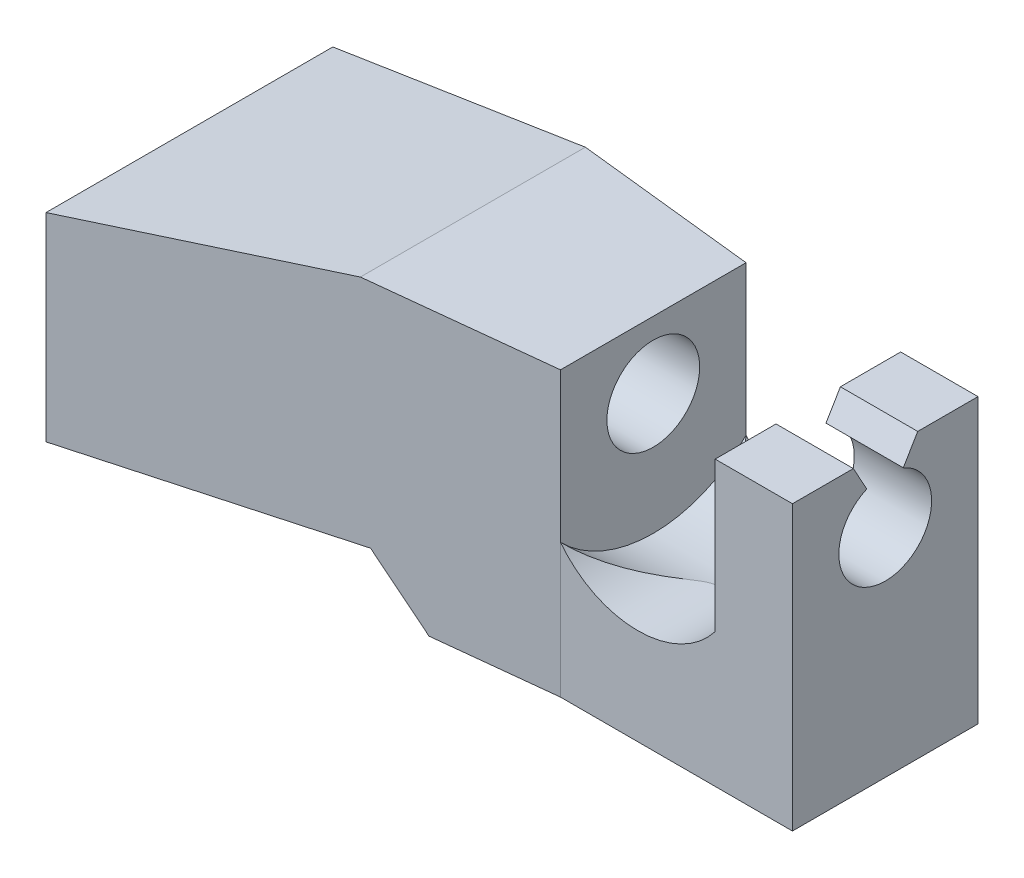
ISO-10303-21;
HEADER;
FILE_DESCRIPTION(('STEP AP214'),'2;1');
FILE_NAME('part.step','',(''),(''),'','','');
FILE_SCHEMA(('AUTOMOTIVE_DESIGN { 1 0 10303 214 1 1 1 1 }'));
ENDSEC;
DATA;
#1=APPLICATION_CONTEXT('core data for automotive mechanical design processes');
#2=APPLICATION_PROTOCOL_DEFINITION('international standard','automotive_design',2000,#1);
#3=PRODUCT_CONTEXT('',#1,'mechanical');
#4=PRODUCT('Part','Part','',(#3));
#5=PRODUCT_RELATED_PRODUCT_CATEGORY('part','',(#4));
#6=PRODUCT_DEFINITION_FORMATION('','',#4);
#7=PRODUCT_DEFINITION_CONTEXT('part definition',#1,'design');
#8=PRODUCT_DEFINITION('design','',#6,#7);
#9=PRODUCT_DEFINITION_SHAPE('','',#8);
#10=(LENGTH_UNIT() NAMED_UNIT(*) SI_UNIT(.MILLI.,.METRE.));
#11=(NAMED_UNIT(*) PLANE_ANGLE_UNIT() SI_UNIT($,.RADIAN.));
#12=(NAMED_UNIT(*) SI_UNIT($,.STERADIAN.) SOLID_ANGLE_UNIT());
#13=UNCERTAINTY_MEASURE_WITH_UNIT(LENGTH_MEASURE(1.E-05),#10,'distance_accuracy_value','');
#14=(GEOMETRIC_REPRESENTATION_CONTEXT(3) GLOBAL_UNCERTAINTY_ASSIGNED_CONTEXT((#13)) GLOBAL_UNIT_ASSIGNED_CONTEXT((#10,
#11,#12)) REPRESENTATION_CONTEXT('',''));
#15=CARTESIAN_POINT('',(0.,0.,0.));
#16=DIRECTION('',(0.,0.,1.));
#17=DIRECTION('',(1.,0.,0.));
#18=AXIS2_PLACEMENT_3D('',#15,#16,#17);
#19=CARTESIAN_POINT('',(0.,11.1135475228581,0.));
#20=DIRECTION('',(0.,-1.,0.));
#21=DIRECTION('',(1.,0.,0.));
#22=AXIS2_PLACEMENT_3D('',#19,#20,#21);
#23=PLANE('',#22);
#24=DIRECTION('',(1.,0.,0.));
#25=VECTOR('',#24,1.);
#26=CARTESIAN_POINT('',(181.643167142005,11.1135475228587,-6.30477493299963));
#27=LINE('',#26,#25);
#28=CARTESIAN_POINT('',(195.,11.1135475228588,-6.30477493299964));
#29=VERTEX_POINT('',#28);
#30=CARTESIAN_POINT('',(210.,11.1135475228588,-6.30477493299963));
#31=VERTEX_POINT('',#30);
#32=EDGE_CURVE('E597',#29,#31,#27,.T.);
#33=ORIENTED_EDGE('',*,*,#32,.T.);
#34=DIRECTION('',(0.,0.,1.));
#35=VECTOR('',#34,1.);
#36=CARTESIAN_POINT('',(210.,11.1135475228588,18.));
#37=LINE('',#36,#35);
#38=CARTESIAN_POINT('',(210.,11.1135475228588,-18.));
#39=VERTEX_POINT('',#38);
#40=EDGE_CURVE('E244',#39,#31,#37,.T.);
#41=ORIENTED_EDGE('',*,*,#40,.F.);
#42=DIRECTION('',(1.,0.,0.));
#43=VECTOR('',#42,1.);
#44=CARTESIAN_POINT('',(195.,11.1135475228587,-18.));
#45=LINE('',#44,#43);
#46=CARTESIAN_POINT('',(195.,11.1135475228587,-18.));
#47=VERTEX_POINT('',#46);
#48=EDGE_CURVE('E240',#47,#39,#45,.T.);
#49=ORIENTED_EDGE('',*,*,#48,.F.);
#50=DIRECTION('',(0.,0.,-1.));
#51=VECTOR('',#50,1.);
#52=CARTESIAN_POINT('',(195.,11.1135475228587,18.));
#53=LINE('',#52,#51);
#54=EDGE_CURVE('E177',#29,#47,#53,.T.);
#55=ORIENTED_EDGE('',*,*,#54,.F.);
#56=EDGE_LOOP('',(#33,#41,#49,#55));
#57=FACE_BOUND('',#56,.T.);
#58=ADVANCED_FACE('F46',(#57),#23,.F.);
#59=CARTESIAN_POINT('',(165.,1.01770443923973E-13,30.));
#60=DIRECTION('',(1.,0.,0.));
#61=DIRECTION('',(0.,1.,0.));
#62=AXIS2_PLACEMENT_3D('',#59,#60,#61);
#63=PLANE('',#62);
#64=DIRECTION('',(0.,1.,0.));
#65=VECTOR('',#64,1.);
#66=CARTESIAN_POINT('',(165.,-45.0022623154871,18.));
#67=LINE('',#66,#65);
#68=CARTESIAN_POINT('',(165.,-17.8864524771414,18.));
#69=VERTEX_POINT('',#68);
#70=CARTESIAN_POINT('',(165.,11.1135475228586,18.));
#71=VERTEX_POINT('',#70);
#72=EDGE_CURVE('E272',#69,#71,#67,.T.);
#73=ORIENTED_EDGE('',*,*,#72,.F.);
#74=CARTESIAN_POINT('',(165.,1.01770443923973E-13,0.));
#75=DIRECTION('',(1.,0.,0.));
#76=DIRECTION('',(0.,1.,0.));
#77=AXIS2_PLACEMENT_3D('',#74,#75,#76);
#78=CIRCLE('',#77,25.375680921249);
#79=CARTESIAN_POINT('',(165.,-17.8864524771414,-18.));
#80=VERTEX_POINT('',#79);
#81=EDGE_CURVE('E264',#69,#80,#78,.T.);
#82=ORIENTED_EDGE('',*,*,#81,.T.);
#83=DIRECTION('',(0.,1.,0.));
#84=VECTOR('',#83,1.);
#85=CARTESIAN_POINT('',(165.,-45.0022623154871,-18.));
#86=LINE('',#85,#84);
#87=CARTESIAN_POINT('',(165.,11.1135475228586,-18.));
#88=VERTEX_POINT('',#87);
#89=EDGE_CURVE('E266',#80,#88,#86,.T.);
#90=ORIENTED_EDGE('',*,*,#89,.T.);
#91=DIRECTION('',(0.,0.,-1.));
#92=VECTOR('',#91,1.);
#93=CARTESIAN_POINT('',(165.,11.1135475228586,30.));
#94=LINE('',#93,#92);
#95=EDGE_CURVE('E290',#71,#88,#94,.T.);
#96=ORIENTED_EDGE('',*,*,#95,.F.);
#97=EDGE_LOOP('',(#73,#82,#90,#96));
#98=FACE_BOUND('',#97,.T.);
#99=CARTESIAN_POINT('',(165.,-1.8864524771414,0.));
#100=DIRECTION('',(1.,0.,0.));
#101=DIRECTION('',(0.,1.,0.));
#102=AXIS2_PLACEMENT_3D('',#99,#100,#101);
#103=CIRCLE('',#102,9.);
#104=CARTESIAN_POINT('',(165.,7.1135475228586,0.));
#105=VERTEX_POINT('',#104);
#106=EDGE_CURVE('E259',#105,#105,#103,.F.);
#107=ORIENTED_EDGE('',*,*,#106,.T.);
#108=EDGE_LOOP('',(#107));
#109=FACE_BOUND('',#108,.T.);
#110=ADVANCED_FACE('F295',(#98,#109),#63,.T.);
#111=CARTESIAN_POINT('',(6.5430535547537,-50.0318697234433,30.));
#112=DIRECTION('',(0.129673524416725,-0.991556744248833,0.));
#113=DIRECTION('',(0.991556744248833,0.129673524416725,0.));
#114=AXIS2_PLACEMENT_3D('',#111,#112,#113);
#115=PLANE('',#114);
#116=DIRECTION('',(0.,0.,1.));
#117=VECTOR('',#116,1.);
#118=CARTESIAN_POINT('',(75.,-41.0792267528315,30.));
#119=LINE('',#118,#117);
#120=CARTESIAN_POINT('',(75.,-41.0792267528315,-27.8248115316507));
#121=VERTEX_POINT('',#120);
#122=CARTESIAN_POINT('',(75.,-41.0792267528315,27.8248115316507));
#123=VERTEX_POINT('',#122);
#124=EDGE_CURVE('E360',#121,#123,#119,.T.);
#125=ORIENTED_EDGE('',*,*,#124,.F.);
#126=DIRECTION('',(-0.985798498601788,-0.128920474213758,-0.107614271743853));
#127=VECTOR('',#126,1.);
#128=CARTESIAN_POINT('',(13.4702441494748,-49.1259475723067,-34.5416810296495));
#129=LINE('',#128,#127);
#130=CARTESIAN_POINT('',(131.768694213775,-33.6551466909161,-21.6276812922257));
#131=VERTEX_POINT('',#130);
#132=EDGE_CURVE('E204',#131,#121,#129,.T.);
#133=ORIENTED_EDGE('',*,*,#132,.F.);
#134=DIRECTION('',(0.,0.,1.));
#135=VECTOR('',#134,1.);
#136=CARTESIAN_POINT('',(131.768694213775,-33.6551466909161,0.));
#137=LINE('',#136,#135);
#138=CARTESIAN_POINT('',(131.768694213775,-33.6551466909161,21.6276812922257));
#139=VERTEX_POINT('',#138);
#140=EDGE_CURVE('E56',#131,#139,#137,.T.);
#141=ORIENTED_EDGE('',*,*,#140,.T.);
#142=DIRECTION('',(-0.985798498601788,-0.128920474213758,0.107614271743853));
#143=VECTOR('',#142,1.);
#144=CARTESIAN_POINT('',(7.10508489868191,-49.9583685490299,35.236530918627));
#145=LINE('',#144,#143);
#146=EDGE_CURVE('E202',#139,#123,#145,.T.);
#147=ORIENTED_EDGE('',*,*,#146,.T.);
#148=EDGE_LOOP('',(#125,#133,#141,#147));
#149=FACE_BOUND('',#148,.T.);
#150=ADVANCED_FACE('F201',(#149),#115,.T.);
#151=CARTESIAN_POINT('',(0.,11.1135475228586,30.));
#152=DIRECTION('',(0.,1.,0.));
#153=DIRECTION('',(0.,0.,1.));
#154=AXIS2_PLACEMENT_3D('',#151,#152,#153);
#155=PLANE('',#154);
#156=DIRECTION('',(0.,0.,-1.));
#157=VECTOR('',#156,1.);
#158=CARTESIAN_POINT('',(130.,11.1135475228586,30.));
#159=LINE('',#158,#157);
#160=CARTESIAN_POINT('',(130.,11.1135475228586,21.8207600400864));
#161=VERTEX_POINT('',#160);
#162=CARTESIAN_POINT('',(130.,11.1135475228586,-21.8207600400864));
#163=VERTEX_POINT('',#162);
#164=EDGE_CURVE('E287',#161,#163,#159,.T.);
#165=ORIENTED_EDGE('',*,*,#164,.F.);
#166=DIRECTION('',(0.994094279368424,0.,-0.10851987710541));
#167=VECTOR('',#166,1.);
#168=CARTESIAN_POINT('',(0.648585146611552,11.1135475228586,35.9413519543853));
#169=LINE('',#168,#167);
#170=EDGE_CURVE('E283',#161,#71,#169,.T.);
#171=ORIENTED_EDGE('',*,*,#170,.T.);
#172=ORIENTED_EDGE('',*,*,#95,.T.);
#173=DIRECTION('',(0.994094279368424,0.,0.10851987710541));
#174=VECTOR('',#173,1.);
#175=CARTESIAN_POINT('',(7.12132448830668,11.1135475228586,-35.2347581307669));
#176=LINE('',#175,#174);
#177=EDGE_CURVE('E277',#163,#88,#176,.T.);
#178=ORIENTED_EDGE('',*,*,#177,.F.);
#179=EDGE_LOOP('',(#165,#171,#172,#178));
#180=FACE_BOUND('',#179,.T.);
#181=ADVANCED_FACE('F346',(#180),#155,.T.);
#182=CARTESIAN_POINT('',(4.9547361598082,-19.9470303665329,30.));
#183=DIRECTION('',(-0.241069014795778,0.970507975292008,0.));
#184=DIRECTION('',(-0.970507975292008,-0.241069014795778,0.));
#185=AXIS2_PLACEMENT_3D('',#182,#183,#184);
#186=PLANE('',#185);
#187=DIRECTION('',(0.,0.,-1.));
#188=VECTOR('',#187,1.);
#189=CARTESIAN_POINT('',(75.,-2.54815969781461,30.));
#190=LINE('',#189,#188);
#191=CARTESIAN_POINT('',(75.,-2.54815969781461,27.8248115316507));
#192=VERTEX_POINT('',#191);
#193=CARTESIAN_POINT('',(75.,-2.54815969781461,-27.8248115316507));
#194=VERTEX_POINT('',#193);
#195=EDGE_CURVE('E357',#192,#194,#190,.T.);
#196=ORIENTED_EDGE('',*,*,#195,.F.);
#197=DIRECTION('',(0.965106735807369,0.239727375659998,-0.1053554643026));
#198=VECTOR('',#197,1.);
#199=CARTESIAN_POINT('',(5.51105117651429,-19.8088446777929,35.4105429285758));
#200=LINE('',#199,#198);
#201=EDGE_CURVE('E281',#192,#161,#200,.T.);
#202=ORIENTED_EDGE('',*,*,#201,.T.);
#203=ORIENTED_EDGE('',*,*,#164,.T.);
#204=DIRECTION('',(0.965106735807369,0.239727375659998,0.1053554643026));
#205=VECTOR('',#204,1.);
#206=CARTESIAN_POINT('',(11.6118072716674,-18.2934493396707,-34.7445564970709));
#207=LINE('',#206,#205);
#208=EDGE_CURVE('E271',#194,#163,#207,.T.);
#209=ORIENTED_EDGE('',*,*,#208,.F.);
#210=EDGE_LOOP('',(#196,#202,#203,#209));
#211=FACE_BOUND('',#210,.T.);
#212=ADVANCED_FACE('F356',(#211),#186,.T.);
#213=CARTESIAN_POINT('',(3.88495481745911,-45.0022623154871,-35.5880550425761));
#214=DIRECTION('',(-0.10851987710541,0.,0.994094279368424));
#215=DIRECTION('',(0.994094279368424,0.,0.10851987710541));
#216=AXIS2_PLACEMENT_3D('',#213,#214,#215);
#217=PLANE('',#216);
#218=ORIENTED_EDGE('',*,*,#132,.T.);
#219=DIRECTION('',(0.,1.,0.));
#220=VECTOR('',#219,1.);
#221=CARTESIAN_POINT('',(75.,-45.0022623154871,-27.8248115316507));
#222=LINE('',#221,#220);
#223=EDGE_CURVE('E361',#121,#194,#222,.T.);
#224=ORIENTED_EDGE('',*,*,#223,.T.);
#225=ORIENTED_EDGE('',*,*,#208,.T.);
#226=ORIENTED_EDGE('',*,*,#177,.T.);
#227=ORIENTED_EDGE('',*,*,#89,.F.);
#228=CARTESIAN_POINT('',(165.,-43.8864524771414,-18.));
#229=VERTEX_POINT('',#228);
#230=EDGE_CURVE('E273',#229,#80,#86,.T.);
#231=ORIENTED_EDGE('',*,*,#230,.F.);
#232=DIRECTION('',(0.994094279368424,0.,0.10851987710541));
#233=VECTOR('',#232,1.);
#234=CARTESIAN_POINT('',(130.,-43.8864524771415,-21.8207600400864));
#235=LINE('',#234,#233);
#236=CARTESIAN_POINT('',(142.,-43.8864524771415,-20.5107851691996));
#237=VERTEX_POINT('',#236);
#238=EDGE_CURVE('E220',#237,#229,#235,.T.);
#239=ORIENTED_EDGE('',*,*,#238,.F.);
#240=DIRECTION('',(-0.705009517987616,0.705009517987606,-0.0769620626916468));
#241=VECTOR('',#240,1.);
#242=CARTESIAN_POINT('',(143.112894420145,-44.999346897286,-20.3892965255046));
#243=LINE('',#242,#241);
#244=EDGE_CURVE('E190',#237,#131,#243,.T.);
#245=ORIENTED_EDGE('',*,*,#244,.T.);
#246=EDGE_LOOP('',(#218,#224,#225,#226,#227,#231,#239,#245));
#247=FACE_BOUND('',#246,.T.);
#248=ADVANCED_FACE('F351',(#247),#217,.F.);
#249=CARTESIAN_POINT('',(3.88495481745911,-45.0022623154871,35.5880550425761));
#250=DIRECTION('',(0.10851987710541,0.,0.994094279368424));
#251=DIRECTION('',(0.994094279368424,0.,-0.10851987710541));
#252=AXIS2_PLACEMENT_3D('',#249,#250,#251);
#253=PLANE('',#252);
#254=DIRECTION('',(0.,1.,0.));
#255=VECTOR('',#254,1.);
#256=CARTESIAN_POINT('',(75.,-45.0022623154871,27.8248115316507));
#257=LINE('',#256,#255);
#258=EDGE_CURVE('E12',#123,#192,#257,.T.);
#259=ORIENTED_EDGE('',*,*,#258,.F.);
#260=ORIENTED_EDGE('',*,*,#146,.F.);
#261=DIRECTION('',(0.705009517987616,-0.705009517987606,-0.0769620626916468));
#262=VECTOR('',#261,1.);
#263=CARTESIAN_POINT('',(73.0880390753775,25.0255084474802,28.0335299287651));
#264=LINE('',#263,#262);
#265=CARTESIAN_POINT('',(142.,-43.8864524771415,20.5107851691996));
#266=VERTEX_POINT('',#265);
#267=EDGE_CURVE('E193',#139,#266,#264,.T.);
#268=ORIENTED_EDGE('',*,*,#267,.T.);
#269=DIRECTION('',(-0.994094279368424,0.,0.10851987710541));
#270=VECTOR('',#269,1.);
#271=CARTESIAN_POINT('',(165.,-43.8864524771414,18.));
#272=LINE('',#271,#270);
#273=CARTESIAN_POINT('',(165.,-43.8864524771414,18.));
#274=VERTEX_POINT('',#273);
#275=EDGE_CURVE('E213',#274,#266,#272,.T.);
#276=ORIENTED_EDGE('',*,*,#275,.F.);
#277=EDGE_CURVE('E269',#274,#69,#67,.T.);
#278=ORIENTED_EDGE('',*,*,#277,.T.);
#279=ORIENTED_EDGE('',*,*,#72,.T.);
#280=ORIENTED_EDGE('',*,*,#170,.F.);
#281=ORIENTED_EDGE('',*,*,#201,.F.);
#282=EDGE_LOOP('',(#259,#260,#268,#276,#278,#279,#280,#281));
#283=FACE_BOUND('',#282,.T.);
#284=ADVANCED_FACE('F211',(#283),#253,.T.);
#285=CARTESIAN_POINT('',(210.,-33.8864524771414,18.));
#286=DIRECTION('',(0.,0.,1.));
#287=DIRECTION('',(1.,0.,0.));
#288=AXIS2_PLACEMENT_3D('',#285,#286,#287);
#289=PLANE('',#288);
#290=CARTESIAN_POINT('',(180.,-6.22454868745072,18.));
#291=DIRECTION('',(0.,0.,1.));
#292=DIRECTION('',(1.,0.,0.));
#293=AXIS2_PLACEMENT_3D('',#290,#291,#292);
#294=CIRCLE('',#293,19.);
#295=CARTESIAN_POINT('',(195.,-17.8864524771414,18.));
#296=VERTEX_POINT('',#295);
#297=EDGE_CURVE('E338',#69,#296,#294,.T.);
#298=ORIENTED_EDGE('',*,*,#297,.F.);
#299=ORIENTED_EDGE('',*,*,#277,.F.);
#300=DIRECTION('',(-1.,0.,0.));
#301=VECTOR('',#300,1.);
#302=CARTESIAN_POINT('',(210.,-43.8864524771412,18.));
#303=LINE('',#302,#301);
#304=CARTESIAN_POINT('',(210.,-43.8864524771412,18.));
#305=VERTEX_POINT('',#304);
#306=EDGE_CURVE('E181',#305,#274,#303,.T.);
#307=ORIENTED_EDGE('',*,*,#306,.F.);
#308=DIRECTION('',(0.,1.,0.));
#309=VECTOR('',#308,1.);
#310=CARTESIAN_POINT('',(210.,-33.8864524771414,18.));
#311=LINE('',#310,#309);
#312=CARTESIAN_POINT('',(210.,11.1135475228588,18.));
#313=VERTEX_POINT('',#312);
#314=EDGE_CURVE('E260',#305,#313,#311,.T.);
#315=ORIENTED_EDGE('',*,*,#314,.T.);
#316=DIRECTION('',(-1.,0.,0.));
#317=VECTOR('',#316,1.);
#318=CARTESIAN_POINT('',(195.,11.1135475228587,18.));
#319=LINE('',#318,#317);
#320=CARTESIAN_POINT('',(195.,11.1135475228587,18.));
#321=VERTEX_POINT('',#320);
#322=EDGE_CURVE('E247',#313,#321,#319,.T.);
#323=ORIENTED_EDGE('',*,*,#322,.T.);
#324=DIRECTION('',(0.,-1.,0.));
#325=VECTOR('',#324,1.);
#326=CARTESIAN_POINT('',(195.,11.1135475228587,18.));
#327=LINE('',#326,#325);
#328=EDGE_CURVE('E251',#321,#296,#327,.T.);
#329=ORIENTED_EDGE('',*,*,#328,.T.);
#330=EDGE_LOOP('',(#298,#299,#307,#315,#323,#329));
#331=FACE_BOUND('',#330,.T.);
#332=ADVANCED_FACE('F337',(#331),#289,.T.);
#333=CARTESIAN_POINT('',(210.,-33.8864524771414,-18.));
#334=DIRECTION('',(0.,0.,1.));
#335=DIRECTION('',(1.,0.,0.));
#336=AXIS2_PLACEMENT_3D('',#333,#334,#335);
#337=PLANE('',#336);
#338=ORIENTED_EDGE('',*,*,#230,.T.);
#339=CARTESIAN_POINT('',(180.,-6.22454868745072,-18.));
#340=DIRECTION('',(0.,0.,1.));
#341=DIRECTION('',(1.,0.,0.));
#342=AXIS2_PLACEMENT_3D('',#339,#340,#341);
#343=CIRCLE('',#342,19.);
#344=CARTESIAN_POINT('',(195.,-17.8864524771414,-18.));
#345=VERTEX_POINT('',#344);
#346=EDGE_CURVE('E225',#80,#345,#343,.T.);
#347=ORIENTED_EDGE('',*,*,#346,.T.);
#348=DIRECTION('',(0.,-1.,0.));
#349=VECTOR('',#348,1.);
#350=CARTESIAN_POINT('',(195.,11.1135475228587,-18.));
#351=LINE('',#350,#349);
#352=EDGE_CURVE('E250',#47,#345,#351,.T.);
#353=ORIENTED_EDGE('',*,*,#352,.F.);
#354=ORIENTED_EDGE('',*,*,#48,.T.);
#355=DIRECTION('',(0.,1.,0.));
#356=VECTOR('',#355,1.);
#357=CARTESIAN_POINT('',(210.,-33.8864524771414,-18.));
#358=LINE('',#357,#356);
#359=CARTESIAN_POINT('',(210.,-43.8864524771412,-18.));
#360=VERTEX_POINT('',#359);
#361=EDGE_CURVE('E263',#360,#39,#358,.T.);
#362=ORIENTED_EDGE('',*,*,#361,.F.);
#363=DIRECTION('',(1.,0.,0.));
#364=VECTOR('',#363,1.);
#365=CARTESIAN_POINT('',(165.,-43.8864524771414,-18.));
#366=LINE('',#365,#364);
#367=EDGE_CURVE('E223',#229,#360,#366,.T.);
#368=ORIENTED_EDGE('',*,*,#367,.F.);
#369=EDGE_LOOP('',(#338,#347,#353,#354,#362,#368));
#370=FACE_BOUND('',#369,.T.);
#371=ADVANCED_FACE('F406',(#370),#337,.F.);
#372=CARTESIAN_POINT('',(210.,1.29526019539602E-13,0.));
#373=DIRECTION('',(-1.,0.,0.));
#374=DIRECTION('',(0.,-1.,0.));
#375=AXIS2_PLACEMENT_3D('',#372,#373,#374);
#376=CYLINDRICAL_SURFACE('',#375,25.375680921249);
#377=CARTESIAN_POINT('',(195.,-17.8864524771414,18.));
#378=CARTESIAN_POINT('',(194.805895014034,-18.1361033559,17.7519183297833));
#379=CARTESIAN_POINT('',(194.607232011286,-18.3787838233469,17.500452030966));
#380=CARTESIAN_POINT('',(194.201615642701,-18.8503518247224,16.9914627861834));
#381=CARTESIAN_POINT('',(193.994663907619,-19.0792420498165,16.7339410356662));
#382=CARTESIAN_POINT('',(193.57338425127,-19.5233010024235,16.2136597702265));
#383=CARTESIAN_POINT('',(193.359062237287,-19.7384803419572,15.9509045179111));
#384=CARTESIAN_POINT('',(192.92356998621,-20.1555299204811,15.4205582157739));
#385=CARTESIAN_POINT('',(192.702399375797,-20.3573994320652,15.1529669026693));
#386=CARTESIAN_POINT('',(192.02749458968,-20.945163899647,14.3413017249564));
#387=CARTESIAN_POINT('',(191.564244772087,-21.3112508990229,13.7906513391202));
#388=CARTESIAN_POINT('',(190.616796153187,-21.9923667844541,12.6762605395656));
#389=CARTESIAN_POINT('',(190.132597159291,-22.3073952009923,12.1125200055292));
#390=CARTESIAN_POINT('',(189.097589070874,-22.9167404652288,10.9196781826376));
#391=CARTESIAN_POINT('',(188.544909239902,-23.2059822729106,10.2895965491817));
#392=CARTESIAN_POINT('',(187.700700634076,-23.5968083896639,9.33987547495078));
#393=CARTESIAN_POINT('',(187.416579243267,-23.7199761329967,9.02233027463105));
#394=CARTESIAN_POINT('',(186.843223366493,-23.9520971182695,8.38669499547009));
#395=CARTESIAN_POINT('',(186.553989427344,-24.0610518700467,8.06860497814743));
#396=CARTESIAN_POINT('',(185.971402727218,-24.2644242703748,7.43459107307991));
#397=CARTESIAN_POINT('',(185.67807719817,-24.3589107383477,7.11866422309474));
#398=CARTESIAN_POINT('',(185.084728526551,-24.5341437893151,6.48905225856437));
#399=CARTESIAN_POINT('',(184.784702773263,-24.6148849069666,6.17536808300827));
#400=CARTESIAN_POINT('',(184.17653312743,-24.7624706222266,5.55397511657059));
#401=CARTESIAN_POINT('',(183.868409488114,-24.8293467466967,5.24625424437926));
#402=CARTESIAN_POINT('',(183.395936898663,-24.9192850506092,4.79355733049475));
#403=CARTESIAN_POINT('',(183.236785230563,-24.9475276311449,4.64418648027106));
#404=CARTESIAN_POINT('',(182.913809498545,-25.0005055227407,4.34996234481687));
#405=CARTESIAN_POINT('',(182.749986466616,-25.0252416013494,4.2051080763704));
#406=CARTESIAN_POINT('',(182.492132337749,-25.0606218096649,3.9870386914199));
#407=CARTESIAN_POINT('',(182.400402609159,-25.0725417713728,3.91132347703063));
#408=CARTESIAN_POINT('',(182.214568854778,-25.0952782539939,3.76269520814127));
#409=CARTESIAN_POINT('',(182.120464460362,-25.1060946022598,3.68978259318307));
#410=CARTESIAN_POINT('',(181.833868382296,-25.136820442116,3.47646473754336));
#411=CARTESIAN_POINT('',(181.636987755169,-25.155021536958,3.34138698912479));
#412=CARTESIAN_POINT('',(181.292947495887,-25.1810132643221,3.13825868266473));
#413=CARTESIAN_POINT('',(181.150426659094,-25.1902647592045,3.06269256589969));
#414=CARTESIAN_POINT('',(180.856110095054,-25.2058194647441,2.93192366570114));
#415=CARTESIAN_POINT('',(180.704340861306,-25.2121306872147,2.87666563359779));
#416=CARTESIAN_POINT('',(180.430103606638,-25.2200480227895,2.80630391779741));
#417=CARTESIAN_POINT('',(180.309376785992,-25.2224210446968,2.78473622130744));
#418=CARTESIAN_POINT('',(180.066051370097,-25.224821730461,2.76291419869656));
#419=CARTESIAN_POINT('',(179.943455807401,-25.2248528580322,2.76262839618327));
#420=CARTESIAN_POINT('',(179.700460579065,-25.2225761166275,2.7833285840365));
#421=CARTESIAN_POINT('',(179.580056847092,-25.220273153279,2.80426996062939));
#422=CARTESIAN_POINT('',(179.343759303414,-25.2135820662191,2.86379641790901));
#423=CARTESIAN_POINT('',(179.227873118654,-25.2091905685191,2.90241004397101));
#424=CARTESIAN_POINT('',(178.979502367715,-25.1976068773285,3.00145038782272));
#425=CARTESIAN_POINT('',(178.848177417628,-25.1900359267952,3.06465994097317));
#426=CARTESIAN_POINT('',(178.592284767377,-25.1727630120521,3.20345077759299));
#427=CARTESIAN_POINT('',(178.467730645163,-25.1630569495073,3.27905578198597));
#428=CARTESIAN_POINT('',(178.22317726281,-25.1416861140311,3.43909535438742));
#429=CARTESIAN_POINT('',(178.103225341807,-25.1300054946028,3.52359908514034));
#430=CARTESIAN_POINT('',(177.867860786896,-25.10490738141,3.69819135379594));
#431=CARTESIAN_POINT('',(177.752444336886,-25.0914913904143,3.78827502490241));
#432=CARTESIAN_POINT('',(177.391243123093,-25.0462599818431,4.08054571251338));
#433=CARTESIAN_POINT('',(177.151752075431,-25.0113597760659,4.2899907181524));
#434=CARTESIAN_POINT('',(176.682339203532,-24.9341583521162,4.71811386998237));
#435=CARTESIAN_POINT('',(176.452424493657,-24.8918517489115,4.93679864583547));
#436=CARTESIAN_POINT('',(175.998666030235,-24.7998820240528,5.37980562517099));
#437=CARTESIAN_POINT('',(175.774835787563,-24.7502038977897,5.60413853333546));
#438=CARTESIAN_POINT('',(175.332034497495,-24.6436122328764,6.05569238000221));
#439=CARTESIAN_POINT('',(175.113061953996,-24.586700959316,6.28291239443256));
#440=CARTESIAN_POINT('',(174.679234794506,-24.4657131298981,6.7386620505247));
#441=CARTESIAN_POINT('',(174.464374254183,-24.4016479615289,6.96718907662674));
#442=CARTESIAN_POINT('',(174.037839935954,-24.2662417936442,7.42507397218275));
#443=CARTESIAN_POINT('',(173.826166364358,-24.1949003253981,7.65443189424298));
#444=CARTESIAN_POINT('',(173.195763072245,-23.9700127668179,8.34243728896488));
#445=CARTESIAN_POINT('',(172.781257124033,-23.805493492301,8.80143393077326));
#446=CARTESIAN_POINT('',(172.029504580876,-23.4759511506552,9.64232105792032));
#447=CARTESIAN_POINT('',(171.690688777776,-23.3153916508679,10.0245709085672));
#448=CARTESIAN_POINT('',(171.020512699755,-22.9729942163319,10.78614898974));
#449=CARTESIAN_POINT('',(170.68915294346,-22.7911548068242,11.1654770158312));
#450=CARTESIAN_POINT('',(170.034359307143,-22.4057214247839,11.9200835750055));
#451=CARTESIAN_POINT('',(169.710927235418,-22.2021225446753,12.2953611734639));
#452=CARTESIAN_POINT('',(169.072868959993,-21.7727213895666,13.0406572554242));
#453=CARTESIAN_POINT('',(168.758242428762,-21.5469199418278,13.4106759342843));
#454=CARTESIAN_POINT('',(168.137864308081,-21.071866153476,14.1454450267551));
#455=CARTESIAN_POINT('',(167.832142525096,-20.8225447747586,14.5101760617222));
#456=CARTESIAN_POINT('',(167.231866084592,-20.3005187260298,15.2319552873873));
#457=CARTESIAN_POINT('',(166.937310213663,-20.0278166073918,15.5890043110627));
#458=CARTESIAN_POINT('',(166.360430366766,-19.4580953417549,16.2945884418816));
#459=CARTESIAN_POINT('',(166.07812266115,-19.1610452777056,16.6431119711534));
#460=CARTESIAN_POINT('',(165.527830612035,-18.542321246763,17.3297725329703));
#461=CARTESIAN_POINT('',(165.259852243421,-18.2206371421329,17.6679052082423));
#462=CARTESIAN_POINT('',(165.,-17.8864524771414,18.));
#463=B_SPLINE_CURVE_WITH_KNOTS('',3,(#377,#378,#379,#380,#381,#382,#383,#384,#385,#386,#387,
#388,#389,#390,#391,#392,#393,#394,#395,#396,#397,#398,#399,#400,#401,#402,#403,#404,#405,#406,
#407,#408,#409,#410,#411,#412,#413,#414,#415,#416,#417,#418,#419,#420,#421,#422,#423,#424,#425,
#426,#427,#428,#429,#430,#431,#432,#433,#434,#435,#436,#437,#438,#439,#440,#441,#442,#443,#444,
#445,#446,#447,#448,#449,#450,#451,#452,#453,#454,#455,#456,#457,#458,#459,#460,#461,#462),
.UNSPECIFIED.,.F.,.F.,(4,2,2,2,2,2,2,2,2,2,2,2,2,2,2,2,2,2,2,2,2,2,2,2,2,2,2,2,2,2,2,2,2,2,2,2,
2,2,2,2,2,2,4),(0.,1.20562764106127,2.411019236698,3.61546625133864,4.81997903670232,
7.23968403742087,9.65941128764988,12.3168515323516,13.6472787544095,14.9775645307196,
16.3013117939695,17.6255841744569,18.946811513135,19.6069936089076,20.2670309715908,
20.625579892133,20.98418481766,21.7009707531795,22.1847774227568,22.667257965944,
23.0335941365723,23.3993884771154,23.7644156079602,24.1300344468982,24.5668174428073,
25.0044462727954,25.4457702454721,25.886714574551,26.8461740318735,27.8063340109725,
28.7684758919931,29.7303172133065,30.6906487430885,31.651042175413,33.5700779961962,
35.1759447837409,36.7819229284549,38.3882640488587,39.9945453401236,41.6056976615564,
43.2166743926563,44.8297294125092,46.4434518635691),.UNSPECIFIED.);
#464=EDGE_CURVE('E221',#296,#69,#463,.T.);
#465=ORIENTED_EDGE('',*,*,#464,.F.);
#466=CARTESIAN_POINT('',(195.,1.20274161001059E-13,0.));
#467=DIRECTION('',(-1.,0.,0.));
#468=DIRECTION('',(0.,-1.,0.));
#469=AXIS2_PLACEMENT_3D('',#466,#467,#468);
#470=CIRCLE('',#469,25.375680921249);
#471=EDGE_CURVE('E185',#345,#296,#470,.T.);
#472=ORIENTED_EDGE('',*,*,#471,.F.);
#473=CARTESIAN_POINT('',(165.,-17.8864524771414,-18.));
#474=CARTESIAN_POINT('',(165.194104985966,-18.1361033559,-17.7519183297833));
#475=CARTESIAN_POINT('',(165.392767988714,-18.3787838233469,-17.500452030966));
#476=CARTESIAN_POINT('',(165.798384357299,-18.8503518247224,-16.9914627861834));
#477=CARTESIAN_POINT('',(166.00533609238,-19.0792420498165,-16.7339410356662));
#478=CARTESIAN_POINT('',(166.426615748729,-19.5233010024235,-16.2136597702265));
#479=CARTESIAN_POINT('',(166.640937762712,-19.7384803419572,-15.9509045179111));
#480=CARTESIAN_POINT('',(167.07643001379,-20.1555299204811,-15.4205582157739));
#481=CARTESIAN_POINT('',(167.297600624203,-20.3573994320652,-15.1529669026693));
#482=CARTESIAN_POINT('',(167.97250541032,-20.945163899647,-14.3413017249564));
#483=CARTESIAN_POINT('',(168.435755227913,-21.3112508990229,-13.7906513391202));
#484=CARTESIAN_POINT('',(169.383203846813,-21.9923667844541,-12.6762605395656));
#485=CARTESIAN_POINT('',(169.867402840709,-22.3073952009923,-12.1125200055292));
#486=CARTESIAN_POINT('',(170.902410929126,-22.9167404652288,-10.9196781826376));
#487=CARTESIAN_POINT('',(171.455090760098,-23.2059822729106,-10.2895965491817));
#488=CARTESIAN_POINT('',(172.299299365924,-23.5968083896639,-9.33987547495077));
#489=CARTESIAN_POINT('',(172.583420756733,-23.7199761329967,-9.02233027463104));
#490=CARTESIAN_POINT('',(173.156776633507,-23.9520971182695,-8.38669499547009));
#491=CARTESIAN_POINT('',(173.446010572656,-24.0610518700467,-8.06860497814743));
#492=CARTESIAN_POINT('',(174.028597272782,-24.2644242703748,-7.43459107307992));
#493=CARTESIAN_POINT('',(174.32192280183,-24.3589107383477,-7.11866422309474));
#494=CARTESIAN_POINT('',(174.915271473449,-24.5341437893151,-6.48905225856437));
#495=CARTESIAN_POINT('',(175.215297226737,-24.6148849069666,-6.17536808300827));
#496=CARTESIAN_POINT('',(175.82346687257,-24.7624706222266,-5.55397511657061));
#497=CARTESIAN_POINT('',(176.131590511886,-24.8293467466967,-5.2462542443793));
#498=CARTESIAN_POINT('',(176.604063101337,-24.9192850506092,-4.79355733049477));
#499=CARTESIAN_POINT('',(176.763214769437,-24.9475276311449,-4.64418648027106));
#500=CARTESIAN_POINT('',(177.086190501455,-25.0005055227407,-4.34996234481687));
#501=CARTESIAN_POINT('',(177.250013533384,-25.0252416013494,-4.20510807637042));
#502=CARTESIAN_POINT('',(177.507867662251,-25.0606218096649,-3.98703869141993));
#503=CARTESIAN_POINT('',(177.599597390841,-25.0725417713728,-3.91132347703067));
#504=CARTESIAN_POINT('',(177.785431145222,-25.0952782539939,-3.76269520814129));
#505=CARTESIAN_POINT('',(177.879535539638,-25.1060946022598,-3.68978259318306));
#506=CARTESIAN_POINT('',(178.166131617704,-25.136820442116,-3.47646473754332));
#507=CARTESIAN_POINT('',(178.363012244831,-25.155021536958,-3.34138698912481));
#508=CARTESIAN_POINT('',(178.707052504113,-25.1810132643221,-3.13825868266474));
#509=CARTESIAN_POINT('',(178.849573340906,-25.1902647592045,-3.06269256589967));
#510=CARTESIAN_POINT('',(179.143889904946,-25.2058194647441,-2.93192366570109));
#511=CARTESIAN_POINT('',(179.295659138694,-25.2121306872147,-2.87666563359775));
#512=CARTESIAN_POINT('',(179.569896393362,-25.2200480227895,-2.80630391779739));
#513=CARTESIAN_POINT('',(179.690623214008,-25.2224210446968,-2.78473622130744));
#514=CARTESIAN_POINT('',(179.933948629903,-25.224821730461,-2.76291419869656));
#515=CARTESIAN_POINT('',(180.056544192599,-25.2248528580322,-2.76262839618325));
#516=CARTESIAN_POINT('',(180.299539420935,-25.2225761166275,-2.78332858403649));
#517=CARTESIAN_POINT('',(180.419943152908,-25.220273153279,-2.80426996062942));
#518=CARTESIAN_POINT('',(180.656240696586,-25.2135820662191,-2.86379641790908));
#519=CARTESIAN_POINT('',(180.772126881346,-25.2091905685191,-2.90241004397108));
#520=CARTESIAN_POINT('',(181.020497632285,-25.1976068773285,-3.00145038782278));
#521=CARTESIAN_POINT('',(181.151822582372,-25.1900359267952,-3.06465994097321));
#522=CARTESIAN_POINT('',(181.407715232623,-25.1727630120521,-3.20345077759301));
#523=CARTESIAN_POINT('',(181.532269354837,-25.1630569495073,-3.27905578198599));
#524=CARTESIAN_POINT('',(181.77682273719,-25.1416861140311,-3.43909535438744));
#525=CARTESIAN_POINT('',(181.896774658193,-25.1300054946028,-3.52359908514038));
#526=CARTESIAN_POINT('',(182.132139213104,-25.10490738141,-3.698191353796));
#527=CARTESIAN_POINT('',(182.247555663114,-25.0914913904143,-3.78827502490249));
#528=CARTESIAN_POINT('',(182.608756876906,-25.0462599818431,-4.08054571251349));
#529=CARTESIAN_POINT('',(182.848247924569,-25.0113597760659,-4.28999071815248));
#530=CARTESIAN_POINT('',(183.317660796468,-24.9341583521161,-4.71811386998245));
#531=CARTESIAN_POINT('',(183.547575506343,-24.8918517489115,-4.93679864583558));
#532=CARTESIAN_POINT('',(184.001333969765,-24.7998820240528,-5.37980562517113));
#533=CARTESIAN_POINT('',(184.225164212437,-24.7502038977896,-5.6041385333356));
#534=CARTESIAN_POINT('',(184.667965502505,-24.6436122328763,-6.05569238000236));
#535=CARTESIAN_POINT('',(184.886938046004,-24.5867009593159,-6.28291239443271));
#536=CARTESIAN_POINT('',(185.320765205494,-24.4657131298981,-6.73866205052487));
#537=CARTESIAN_POINT('',(185.535625745817,-24.4016479615288,-6.96718907662692));
#538=CARTESIAN_POINT('',(185.962160064046,-24.2662417936441,-7.42507397218296));
#539=CARTESIAN_POINT('',(186.173833635642,-24.194900325398,-7.6544318942432));
#540=CARTESIAN_POINT('',(186.804236927755,-23.9700127668178,-8.34243728896513));
#541=CARTESIAN_POINT('',(187.218742875967,-23.8054934923009,-8.80143393077354));
#542=CARTESIAN_POINT('',(187.970495419124,-23.475951150655,-9.64232105792063));
#543=CARTESIAN_POINT('',(188.309311222224,-23.3153916508678,-10.0245709085675));
#544=CARTESIAN_POINT('',(188.979487300245,-22.9729942163318,-10.7861489897403));
#545=CARTESIAN_POINT('',(189.31084705654,-22.791154806824,-11.1654770158315));
#546=CARTESIAN_POINT('',(189.965640692857,-22.4057214247837,-11.9200835750057));
#547=CARTESIAN_POINT('',(190.289072764582,-22.2021225446751,-12.2953611734641));
#548=CARTESIAN_POINT('',(190.927131040007,-21.7727213895665,-13.0406572554244));
#549=CARTESIAN_POINT('',(191.241757571238,-21.5469199418277,-13.4106759342845));
#550=CARTESIAN_POINT('',(191.862135691919,-21.0718661534759,-14.1454450267552));
#551=CARTESIAN_POINT('',(192.167857474904,-20.8225447747585,-14.5101760617223));
#552=CARTESIAN_POINT('',(192.768133915408,-20.3005187260297,-15.2319552873874));
#553=CARTESIAN_POINT('',(193.062689786337,-20.0278166073917,-15.5890043110627));
#554=CARTESIAN_POINT('',(193.639569633234,-19.4580953417549,-16.2945884418817));
#555=CARTESIAN_POINT('',(193.921877338849,-19.1610452777055,-16.6431119711535));
#556=CARTESIAN_POINT('',(194.472169387965,-18.542321246763,-17.3297725329702));
#557=CARTESIAN_POINT('',(194.740147756579,-18.2206371421329,-17.6679052082423));
#558=CARTESIAN_POINT('',(195.,-17.8864524771414,-18.));
#559=B_SPLINE_CURVE_WITH_KNOTS('',3,(#473,#474,#475,#476,#477,#478,#479,#480,#481,#482,#483,
#484,#485,#486,#487,#488,#489,#490,#491,#492,#493,#494,#495,#496,#497,#498,#499,#500,#501,#502,
#503,#504,#505,#506,#507,#508,#509,#510,#511,#512,#513,#514,#515,#516,#517,#518,#519,#520,#521,
#522,#523,#524,#525,#526,#527,#528,#529,#530,#531,#532,#533,#534,#535,#536,#537,#538,#539,#540,
#541,#542,#543,#544,#545,#546,#547,#548,#549,#550,#551,#552,#553,#554,#555,#556,#557,#558),
.UNSPECIFIED.,.F.,.F.,(4,2,2,2,2,2,2,2,2,2,2,2,2,2,2,2,2,2,2,2,2,2,2,2,2,2,2,2,2,2,2,2,2,2,2,2,
2,2,2,2,2,2,4),(0.,1.20562764106127,2.411019236698,3.61546625133864,4.81997903670231,
7.23968403742084,9.65941128764988,12.3168515323517,13.6472787544095,14.9775645307197,
16.3013117939695,17.6255841744569,18.946811513135,19.6069936089076,20.2670309715908,
20.625579892133,20.98418481766,21.7009707531796,22.1847774227568,22.6672579659441,
23.0335941365724,23.3993884771154,23.7644156079603,24.1300344468982,24.5668174428074,
25.0044462727955,25.4457702454722,25.8867145745511,26.8461740318736,27.8063340109727,
28.7684758919933,29.7303172133067,30.6906487430888,31.6510421754134,33.5700779961967,
35.1759447837413,36.7819229284553,38.388264048859,39.9945453401238,41.6056976615565,
43.2166743926564,44.8297294125092,46.443451863569),.UNSPECIFIED.);
#560=EDGE_CURVE('E368',#80,#345,#559,.T.);
#561=ORIENTED_EDGE('',*,*,#560,.F.);
#562=ORIENTED_EDGE('',*,*,#81,.F.);
#563=EDGE_LOOP('',(#465,#472,#561,#562));
#564=FACE_BOUND('',#563,.T.);
#565=ADVANCED_FACE('F373',(#564),#376,.F.);
#566=CARTESIAN_POINT('',(210.,1.29526019539602E-13,0.));
#567=DIRECTION('',(1.,0.,0.));
#568=DIRECTION('',(0.,1.,0.));
#569=AXIS2_PLACEMENT_3D('',#566,#567,#568);
#570=PLANE('',#569);
#571=DIRECTION('',(0.,-0.876031787280716,-0.482253364605944));
#572=VECTOR('',#571,1.);
#573=CARTESIAN_POINT('',(210.,11.1135475228588,6.18277198427108));
#574=LINE('',#573,#572);
#575=CARTESIAN_POINT('',(210.,11.1135475228588,6.18277198427108));
#576=VERTEX_POINT('',#575);
#577=CARTESIAN_POINT('',(210.,6.3736998475255,3.57349738677676));
#578=VERTEX_POINT('',#577);
#579=EDGE_CURVE('E63',#576,#578,#574,.T.);
#580=ORIENTED_EDGE('',*,*,#579,.F.);
#581=EDGE_CURVE('E243',#576,#313,#37,.T.);
#582=ORIENTED_EDGE('',*,*,#581,.T.);
#583=ORIENTED_EDGE('',*,*,#314,.F.);
#584=DIRECTION('',(0.,0.,1.));
#585=VECTOR('',#584,1.);
#586=CARTESIAN_POINT('',(210.,-43.8864524771412,-18.));
#587=LINE('',#586,#585);
#588=EDGE_CURVE('E237',#360,#305,#587,.T.);
#589=ORIENTED_EDGE('',*,*,#588,.F.);
#590=ORIENTED_EDGE('',*,*,#361,.T.);
#591=ORIENTED_EDGE('',*,*,#40,.T.);
#592=DIRECTION('',(0.,-0.859849381865744,0.510547784742132));
#593=VECTOR('',#592,1.);
#594=CARTESIAN_POINT('',(210.,11.1135475228588,-6.30477493299963));
#595=LINE('',#594,#593);
#596=CARTESIAN_POINT('',(210.,6.40204419397874,-3.50725290403055));
#597=VERTEX_POINT('',#596);
#598=EDGE_CURVE('E593',#31,#597,#595,.T.);
#599=ORIENTED_EDGE('',*,*,#598,.T.);
#600=CARTESIAN_POINT('',(210.,-1.88645247714137,0.));
#601=DIRECTION('',(1.,0.,0.));
#602=DIRECTION('',(0.,1.,0.));
#603=AXIS2_PLACEMENT_3D('',#600,#601,#602);
#604=CIRCLE('',#603,9.);
#605=EDGE_CURVE('E178',#597,#578,#604,.F.);
#606=ORIENTED_EDGE('',*,*,#605,.T.);
#607=EDGE_LOOP('',(#580,#582,#583,#589,#590,#591,#599,#606));
#608=FACE_BOUND('',#607,.T.);
#609=ADVANCED_FACE('F301',(#608),#570,.T.);
#610=CARTESIAN_POINT('',(210.,-1.88645247714137,0.));
#611=DIRECTION('',(-1.,0.,0.));
#612=DIRECTION('',(0.,-1.,0.));
#613=AXIS2_PLACEMENT_3D('',#610,#611,#612);
#614=CYLINDRICAL_SURFACE('',#613,9.);
#615=ORIENTED_EDGE('',*,*,#106,.F.);
#616=EDGE_LOOP('',(#615));
#617=FACE_BOUND('',#616,.T.);
#618=CARTESIAN_POINT('',(150.,-1.88645247714141,0.));
#619=DIRECTION('',(1.,0.,0.));
#620=DIRECTION('',(0.,1.,0.));
#621=AXIS2_PLACEMENT_3D('',#618,#619,#620);
#622=CIRCLE('',#621,9.);
#623=CARTESIAN_POINT('',(150.,7.11354752285859,0.));
#624=VERTEX_POINT('',#623);
#625=EDGE_CURVE('E254',#624,#624,#622,.T.);
#626=ORIENTED_EDGE('',*,*,#625,.F.);
#627=EDGE_LOOP('',(#626));
#628=FACE_BOUND('',#627,.T.);
#629=ADVANCED_FACE('F297',(#617,#628),#614,.F.);
#630=CARTESIAN_POINT('',(150.,0.,0.));
#631=DIRECTION('',(1.,0.,0.));
#632=DIRECTION('',(0.,1.,0.));
#633=AXIS2_PLACEMENT_3D('',#630,#631,#632);
#634=PLANE('',#633);
#635=ORIENTED_EDGE('',*,*,#625,.T.);
#636=EDGE_LOOP('',(#635));
#637=FACE_BOUND('',#636,.T.);
#638=ADVANCED_FACE('F300',(#637),#634,.T.);
#639=CARTESIAN_POINT('',(195.,11.1135475228587,18.));
#640=DIRECTION('',(-1.,0.,0.));
#641=DIRECTION('',(0.,-1.,0.));
#642=AXIS2_PLACEMENT_3D('',#639,#640,#641);
#643=PLANE('',#642);
#644=DIRECTION('',(0.,-0.876031787280716,-0.482253364605944));
#645=VECTOR('',#644,1.);
#646=CARTESIAN_POINT('',(195.,11.1135475228588,6.1827719842711));
#647=LINE('',#646,#645);
#648=CARTESIAN_POINT('',(195.,11.1135475228588,6.18277198427109));
#649=VERTEX_POINT('',#648);
#650=CARTESIAN_POINT('',(195.,6.37369984752549,3.57349738677676));
#651=VERTEX_POINT('',#650);
#652=EDGE_CURVE('E160',#649,#651,#647,.T.);
#653=ORIENTED_EDGE('',*,*,#652,.T.);
#654=CARTESIAN_POINT('',(195.,-1.88645247714138,0.));
#655=DIRECTION('',(-1.,0.,0.));
#656=DIRECTION('',(0.,-1.,0.));
#657=AXIS2_PLACEMENT_3D('',#654,#655,#656);
#658=CIRCLE('',#657,9.);
#659=CARTESIAN_POINT('',(195.,6.40204419397873,-3.50725290403055));
#660=VERTEX_POINT('',#659);
#661=EDGE_CURVE('E172',#660,#651,#658,.T.);
#662=ORIENTED_EDGE('',*,*,#661,.F.);
#663=DIRECTION('',(0.,-0.859849381865744,0.510547784742132));
#664=VECTOR('',#663,1.);
#665=CARTESIAN_POINT('',(195.,11.1135475228588,-6.30477493299965));
#666=LINE('',#665,#664);
#667=EDGE_CURVE('E71',#29,#660,#666,.T.);
#668=ORIENTED_EDGE('',*,*,#667,.F.);
#669=ORIENTED_EDGE('',*,*,#54,.T.);
#670=ORIENTED_EDGE('',*,*,#352,.T.);
#671=ORIENTED_EDGE('',*,*,#471,.T.);
#672=ORIENTED_EDGE('',*,*,#328,.F.);
#673=EDGE_CURVE('E174',#321,#649,#53,.T.);
#674=ORIENTED_EDGE('',*,*,#673,.T.);
#675=EDGE_LOOP('',(#653,#662,#668,#669,#670,#671,#672,#674));
#676=FACE_BOUND('',#675,.T.);
#677=ADVANCED_FACE('F171',(#676),#643,.T.);
#678=ORIENTED_EDGE('',*,*,#581,.F.);
#679=DIRECTION('',(1.,0.,0.));
#680=VECTOR('',#679,1.);
#681=CARTESIAN_POINT('',(181.643167142005,11.1135475228587,6.18277198427108));
#682=LINE('',#681,#680);
#683=EDGE_CURVE('E332',#649,#576,#682,.T.);
#684=ORIENTED_EDGE('',*,*,#683,.F.);
#685=ORIENTED_EDGE('',*,*,#673,.F.);
#686=ORIENTED_EDGE('',*,*,#322,.F.);
#687=EDGE_LOOP('',(#678,#684,#685,#686));
#688=FACE_BOUND('',#687,.T.);
#689=ADVANCED_FACE('F311',(#688),#23,.F.);
#690=CARTESIAN_POINT('',(210.,-1.88645247714137,0.));
#691=DIRECTION('',(-1.,0.,0.));
#692=DIRECTION('',(0.,-1.,0.));
#693=AXIS2_PLACEMENT_3D('',#690,#691,#692);
#694=CYLINDRICAL_SURFACE('',#693,9.);
#695=ORIENTED_EDGE('',*,*,#661,.T.);
#696=DIRECTION('',(1.,0.,0.));
#697=VECTOR('',#696,1.);
#698=CARTESIAN_POINT('',(181.643167142005,6.37369984752549,3.57349738677676));
#699=LINE('',#698,#697);
#700=EDGE_CURVE('E157',#651,#578,#699,.T.);
#701=ORIENTED_EDGE('',*,*,#700,.T.);
#702=ORIENTED_EDGE('',*,*,#605,.F.);
#703=DIRECTION('',(1.,0.,0.));
#704=VECTOR('',#703,1.);
#705=CARTESIAN_POINT('',(181.643167142005,6.40204419397872,-3.50725290403055));
#706=LINE('',#705,#704);
#707=EDGE_CURVE('E166',#660,#597,#706,.T.);
#708=ORIENTED_EDGE('',*,*,#707,.F.);
#709=EDGE_LOOP('',(#695,#701,#702,#708));
#710=FACE_BOUND('',#709,.T.);
#711=ADVANCED_FACE('F176',(#710),#694,.F.);
#712=CARTESIAN_POINT('',(1.47911383956624E-13,-43.886452477142,0.));
#713=DIRECTION('',(0.,-1.,0.));
#714=DIRECTION('',(1.,0.,0.));
#715=AXIS2_PLACEMENT_3D('',#712,#713,#714);
#716=PLANE('',#715);
#717=ORIENTED_EDGE('',*,*,#275,.T.);
#718=DIRECTION('',(0.,0.,-1.));
#719=VECTOR('',#718,1.);
#720=CARTESIAN_POINT('',(142.,-43.8864524771415,-21.8207600400864));
#721=LINE('',#720,#719);
#722=EDGE_CURVE('E187',#266,#237,#721,.T.);
#723=ORIENTED_EDGE('',*,*,#722,.T.);
#724=ORIENTED_EDGE('',*,*,#238,.T.);
#725=ORIENTED_EDGE('',*,*,#367,.T.);
#726=ORIENTED_EDGE('',*,*,#588,.T.);
#727=ORIENTED_EDGE('',*,*,#306,.T.);
#728=EDGE_LOOP('',(#717,#723,#724,#725,#726,#727));
#729=FACE_BOUND('',#728,.T.);
#730=ADVANCED_FACE('F216',(#729),#716,.T.);
#731=CARTESIAN_POINT('',(142.,-43.8864524771415,0.));
#732=DIRECTION('',(-0.707106781186542,-0.707106781186553,0.));
#733=DIRECTION('',(0.,0.,1.));
#734=AXIS2_PLACEMENT_3D('',#731,#732,#733);
#735=PLANE('',#734);
#736=ORIENTED_EDGE('',*,*,#267,.F.);
#737=ORIENTED_EDGE('',*,*,#140,.F.);
#738=ORIENTED_EDGE('',*,*,#244,.F.);
#739=ORIENTED_EDGE('',*,*,#722,.F.);
#740=EDGE_LOOP('',(#736,#737,#738,#739));
#741=FACE_BOUND('',#740,.T.);
#742=ADVANCED_FACE('F49',(#741),#735,.T.);
#743=CARTESIAN_POINT('',(180.,-6.22454868745072,-22.));
#744=DIRECTION('',(0.,0.,1.));
#745=DIRECTION('',(1.,0.,0.));
#746=AXIS2_PLACEMENT_3D('',#743,#744,#745);
#747=CYLINDRICAL_SURFACE('',#746,19.);
#748=ORIENTED_EDGE('',*,*,#560,.T.);
#749=ORIENTED_EDGE('',*,*,#346,.F.);
#750=EDGE_LOOP('',(#748,#749));
#751=FACE_BOUND('',#750,.T.);
#752=ADVANCED_FACE('F377',(#751),#747,.F.);
#753=ORIENTED_EDGE('',*,*,#464,.T.);
#754=ORIENTED_EDGE('',*,*,#297,.T.);
#755=EDGE_LOOP('',(#753,#754));
#756=FACE_BOUND('',#755,.T.);
#757=ADVANCED_FACE('F382',(#756),#747,.F.);
#758=CARTESIAN_POINT('',(75.,-45.0022623154871,30.));
#759=DIRECTION('',(1.,0.,0.));
#760=DIRECTION('',(0.,0.,-1.));
#761=AXIS2_PLACEMENT_3D('',#758,#759,#760);
#762=PLANE('',#761);
#763=CARTESIAN_POINT('',(75.,-20.0323343197955,0.));
#764=DIRECTION('',(1.,0.,0.));
#765=DIRECTION('',(0.,0.,-1.));
#766=AXIS2_PLACEMENT_3D('',#763,#764,#765);
#767=CIRCLE('',#766,10.);
#768=CARTESIAN_POINT('',(75.,-20.0323343197955,-10.));
#769=VERTEX_POINT('',#768);
#770=EDGE_CURVE('E51',#769,#769,#767,.F.);
#771=ORIENTED_EDGE('',*,*,#770,.F.);
#772=EDGE_LOOP('',(#771));
#773=FACE_BOUND('',#772,.T.);
#774=ORIENTED_EDGE('',*,*,#124,.T.);
#775=ORIENTED_EDGE('',*,*,#258,.T.);
#776=ORIENTED_EDGE('',*,*,#195,.T.);
#777=ORIENTED_EDGE('',*,*,#223,.F.);
#778=EDGE_LOOP('',(#774,#775,#776,#777));
#779=FACE_BOUND('',#778,.T.);
#780=ADVANCED_FACE('F359',(#773,#779),#762,.F.);
#781=CARTESIAN_POINT('',(74.999988,-20.0323343197955,0.));
#782=DIRECTION('',(1.,0.,0.));
#783=DIRECTION('',(0.,0.,-1.));
#784=AXIS2_PLACEMENT_3D('',#781,#782,#783);
#785=CYLINDRICAL_SURFACE('',#784,10.);
#786=CARTESIAN_POINT('',(85.,-20.0323343197955,0.));
#787=DIRECTION('',(-1.,0.,0.));
#788=DIRECTION('',(0.,0.,1.));
#789=AXIS2_PLACEMENT_3D('',#786,#787,#788);
#790=CIRCLE('',#789,10.);
#791=CARTESIAN_POINT('',(85.,-20.0323343197955,-10.));
#792=VERTEX_POINT('',#791);
#793=EDGE_CURVE('E591',#792,#792,#790,.T.);
#794=CARTESIAN_POINT('',(85.,-20.0323343197955,-10.));
#795=CARTESIAN_POINT('',(84.8958333333333,-20.0323343197955,-10.));
#796=CARTESIAN_POINT('',(84.7916666666667,-20.0323343197955,-10.));
#797=CARTESIAN_POINT('',(84.5833333333333,-20.0323343197955,-10.));
#798=CARTESIAN_POINT('',(84.4791666666667,-20.0323343197955,-10.));
#799=CARTESIAN_POINT('',(84.2708333333333,-20.0323343197955,-10.));
#800=CARTESIAN_POINT('',(84.1666666666667,-20.0323343197955,-10.));
#801=CARTESIAN_POINT('',(83.9583333333333,-20.0323343197955,-10.));
#802=CARTESIAN_POINT('',(83.8541666666667,-20.0323343197955,-10.));
#803=CARTESIAN_POINT('',(83.6458333333333,-20.0323343197955,-10.));
#804=CARTESIAN_POINT('',(83.5416666666667,-20.0323343197955,-10.));
#805=CARTESIAN_POINT('',(83.3333333333333,-20.0323343197955,-10.));
#806=CARTESIAN_POINT('',(83.2291666666667,-20.0323343197955,-10.));
#807=CARTESIAN_POINT('',(83.0208333333333,-20.0323343197955,-10.));
#808=CARTESIAN_POINT('',(82.9166666666667,-20.0323343197955,-10.));
#809=CARTESIAN_POINT('',(82.7083333333333,-20.0323343197955,-10.));
#810=CARTESIAN_POINT('',(82.6041666666667,-20.0323343197955,-10.));
#811=CARTESIAN_POINT('',(82.3958333333333,-20.0323343197955,-10.));
#812=CARTESIAN_POINT('',(82.2916666666667,-20.0323343197955,-10.));
#813=CARTESIAN_POINT('',(82.0833333333333,-20.0323343197955,-10.));
#814=CARTESIAN_POINT('',(81.9791666666667,-20.0323343197955,-10.));
#815=CARTESIAN_POINT('',(81.7708333333333,-20.0323343197955,-10.));
#816=CARTESIAN_POINT('',(81.6666666666667,-20.0323343197955,-10.));
#817=CARTESIAN_POINT('',(81.4583333333333,-20.0323343197955,-10.));
#818=CARTESIAN_POINT('',(81.3541666666667,-20.0323343197955,-10.));
#819=CARTESIAN_POINT('',(81.1458333333333,-20.0323343197955,-10.));
#820=CARTESIAN_POINT('',(81.0416666666667,-20.0323343197955,-10.));
#821=CARTESIAN_POINT('',(80.8333333333333,-20.0323343197955,-10.));
#822=CARTESIAN_POINT('',(80.7291666666667,-20.0323343197955,-10.));
#823=CARTESIAN_POINT('',(80.5208333333333,-20.0323343197955,-10.));
#824=CARTESIAN_POINT('',(80.4166666666667,-20.0323343197955,-10.));
#825=CARTESIAN_POINT('',(80.2083333333333,-20.0323343197955,-10.));
#826=CARTESIAN_POINT('',(80.1041666666667,-20.0323343197955,-10.));
#827=CARTESIAN_POINT('',(79.8958333333333,-20.0323343197955,-10.));
#828=CARTESIAN_POINT('',(79.7916666666667,-20.0323343197955,-10.));
#829=CARTESIAN_POINT('',(79.5833333333333,-20.0323343197955,-10.));
#830=CARTESIAN_POINT('',(79.4791666666667,-20.0323343197955,-10.));
#831=CARTESIAN_POINT('',(79.2708333333333,-20.0323343197955,-10.));
#832=CARTESIAN_POINT('',(79.1666666666667,-20.0323343197955,-10.));
#833=CARTESIAN_POINT('',(78.9583333333333,-20.0323343197955,-10.));
#834=CARTESIAN_POINT('',(78.8541666666667,-20.0323343197955,-10.));
#835=CARTESIAN_POINT('',(78.6458333333333,-20.0323343197955,-10.));
#836=CARTESIAN_POINT('',(78.5416666666667,-20.0323343197955,-10.));
#837=CARTESIAN_POINT('',(78.3333333333333,-20.0323343197955,-10.));
#838=CARTESIAN_POINT('',(78.2291666666667,-20.0323343197955,-10.));
#839=CARTESIAN_POINT('',(78.0208333333333,-20.0323343197955,-10.));
#840=CARTESIAN_POINT('',(77.9166666666667,-20.0323343197955,-10.));
#841=CARTESIAN_POINT('',(77.7083333333333,-20.0323343197955,-10.));
#842=CARTESIAN_POINT('',(77.6041666666667,-20.0323343197955,-10.));
#843=CARTESIAN_POINT('',(77.3958333333333,-20.0323343197955,-10.));
#844=CARTESIAN_POINT('',(77.2916666666667,-20.0323343197955,-10.));
#845=CARTESIAN_POINT('',(77.0833333333333,-20.0323343197955,-10.));
#846=CARTESIAN_POINT('',(76.9791666666667,-20.0323343197955,-10.));
#847=CARTESIAN_POINT('',(76.7708333333333,-20.0323343197955,-10.));
#848=CARTESIAN_POINT('',(76.6666666666667,-20.0323343197955,-10.));
#849=CARTESIAN_POINT('',(76.4583333333333,-20.0323343197955,-10.));
#850=CARTESIAN_POINT('',(76.3541666666667,-20.0323343197955,-10.));
#851=CARTESIAN_POINT('',(76.1458333333333,-20.0323343197955,-10.));
#852=CARTESIAN_POINT('',(76.0416666666667,-20.0323343197955,-10.));
#853=CARTESIAN_POINT('',(75.8333333333333,-20.0323343197955,-10.));
#854=CARTESIAN_POINT('',(75.7291666666667,-20.0323343197955,-10.));
#855=CARTESIAN_POINT('',(75.5208333333333,-20.0323343197955,-10.));
#856=CARTESIAN_POINT('',(75.4166666666667,-20.0323343197955,-10.));
#857=CARTESIAN_POINT('',(75.2083333333333,-20.0323343197955,-10.));
#858=CARTESIAN_POINT('',(75.1041666666667,-20.0323343197955,-10.));
#859=CARTESIAN_POINT('',(75.,-20.0323343197955,-10.));
#860=B_SPLINE_CURVE_WITH_KNOTS('',3,(#794,#795,#796,#797,#798,#799,#800,#801,#802,#803,#804,
#805,#806,#807,#808,#809,#810,#811,#812,#813,#814,#815,#816,#817,#818,#819,#820,#821,#822,#823,
#824,#825,#826,#827,#828,#829,#830,#831,#832,#833,#834,#835,#836,#837,#838,#839,#840,#841,#842,
#843,#844,#845,#846,#847,#848,#849,#850,#851,#852,#853,#854,#855,#856,#857,#858,#859),
.UNSPECIFIED.,.F.,.F.,(4,2,2,2,2,2,2,2,2,2,2,2,2,2,2,2,2,2,2,2,2,2,2,2,2,2,2,2,2,2,2,2,4),(0.,
0.312499999999993,0.625000000000001,0.937499999999994,1.25,1.56249999999999,1.875,2.1875,2.5,
2.8125,3.125,3.4375,3.75,4.0625,4.375,4.6875,5.,5.3125,5.62500000000001,5.9375,6.25000000000001,
6.5625,6.87500000000001,7.1875,7.50000000000001,7.8125,8.12500000000001,8.4375,8.75000000000001,
9.0625,9.37500000000001,9.6875,10.),.UNSPECIFIED.);
#861=EDGE_CURVE('BSEAM468',#792,#769,#860,.T.);
#862=ORIENTED_EDGE('',*,*,#793,.F.);
#863=ORIENTED_EDGE('',*,*,#770,.T.);
#864=ORIENTED_EDGE('',*,*,#861,.T.);
#865=ORIENTED_EDGE('',*,*,#861,.F.);
#866=EDGE_LOOP('',(#862,#864,#863,#865));
#867=FACE_BOUND('',#866,.T.);
#868=ADVANCED_FACE('F468',(#867),#785,.F.);
#869=CARTESIAN_POINT('',(85.,-20.0323343197955,0.));
#870=DIRECTION('',(-1.,0.,0.));
#871=DIRECTION('',(0.,0.,1.));
#872=AXIS2_PLACEMENT_3D('',#869,#870,#871);
#873=PLANE('',#872);
#874=ORIENTED_EDGE('',*,*,#793,.T.);
#875=EDGE_LOOP('',(#874));
#876=FACE_BOUND('',#875,.T.);
#877=ADVANCED_FACE('F475',(#876),#873,.T.);
#878=CARTESIAN_POINT('',(181.643167142005,11.1135475228587,-6.30477493299963));
#879=DIRECTION('',(0.,0.510547784742132,0.859849381865744));
#880=DIRECTION('',(0.,-0.859849381865744,0.510547784742132));
#881=AXIS2_PLACEMENT_3D('',#878,#879,#880);
#882=PLANE('',#881);
#883=ORIENTED_EDGE('',*,*,#667,.T.);
#884=ORIENTED_EDGE('',*,*,#707,.T.);
#885=ORIENTED_EDGE('',*,*,#598,.F.);
#886=ORIENTED_EDGE('',*,*,#32,.F.);
#887=EDGE_LOOP('',(#883,#884,#885,#886));
#888=FACE_BOUND('',#887,.T.);
#889=ADVANCED_FACE('F482',(#888),#882,.T.);
#890=CARTESIAN_POINT('',(181.643167142005,11.1135475228587,6.18277198427108));
#891=DIRECTION('',(0.,-0.482253364605944,0.876031787280716));
#892=DIRECTION('',(0.,-0.876031787280716,-0.482253364605944));
#893=AXIS2_PLACEMENT_3D('',#890,#891,#892);
#894=PLANE('',#893);
#895=ORIENTED_EDGE('',*,*,#683,.T.);
#896=ORIENTED_EDGE('',*,*,#579,.T.);
#897=ORIENTED_EDGE('',*,*,#700,.F.);
#898=ORIENTED_EDGE('',*,*,#652,.F.);
#899=EDGE_LOOP('',(#895,#896,#897,#898));
#900=FACE_BOUND('',#899,.T.);
#901=ADVANCED_FACE('F159',(#900),#894,.F.);
#902=CLOSED_SHELL('',(#58,#110,#150,#181,#212,#248,#284,#332,#371,#565,#609,#629,#638,#677,#689,
#711,#730,#742,#752,#757,#780,#868,#877,#889,#901));
#903=MANIFOLD_SOLID_BREP('B2',#902);
#904=ADVANCED_BREP_SHAPE_REPRESENTATION('',(#18,#903),#14);
#905=SHAPE_DEFINITION_REPRESENTATION(#9,#904);
ENDSEC;
END-ISO-10303-21;
